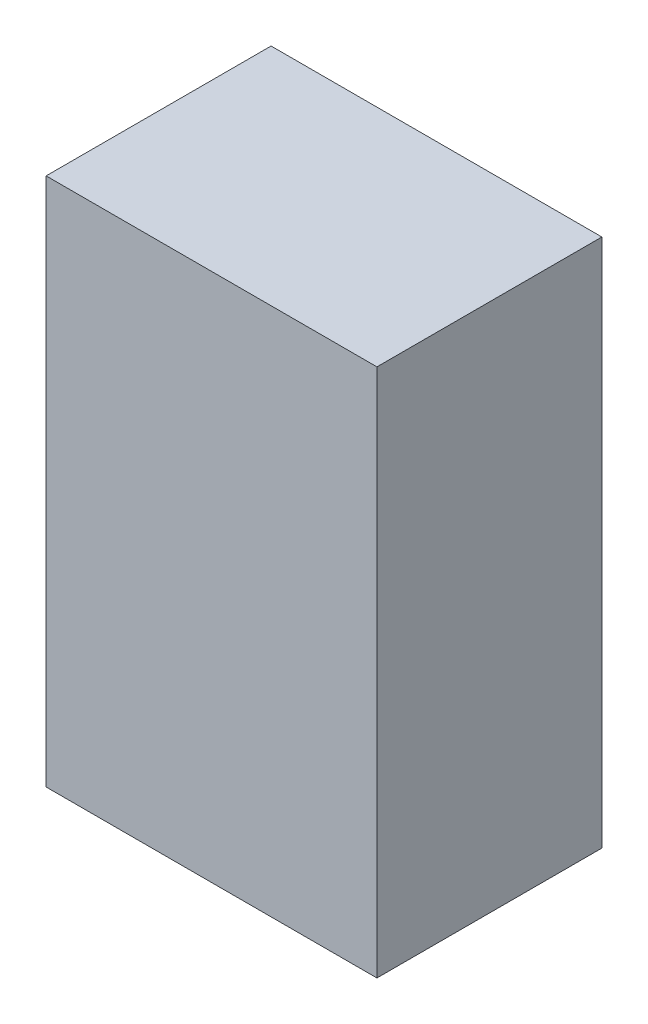
ISO-10303-21;
HEADER;
FILE_DESCRIPTION(('STEP AP214'),'2;1');
FILE_NAME('part.step','',(''),(''),'','','');
FILE_SCHEMA(('AUTOMOTIVE_DESIGN { 1 0 10303 214 1 1 1 1 }'));
ENDSEC;
DATA;
#1=APPLICATION_CONTEXT('core data for automotive mechanical design processes');
#2=APPLICATION_PROTOCOL_DEFINITION('international standard','automotive_design',2000,#1);
#3=PRODUCT_CONTEXT('',#1,'mechanical');
#4=PRODUCT('Part','Part','',(#3));
#5=PRODUCT_RELATED_PRODUCT_CATEGORY('part','',(#4));
#6=PRODUCT_DEFINITION_FORMATION('','',#4);
#7=PRODUCT_DEFINITION_CONTEXT('part definition',#1,'design');
#8=PRODUCT_DEFINITION('design','',#6,#7);
#9=PRODUCT_DEFINITION_SHAPE('','',#8);
#10=(LENGTH_UNIT() NAMED_UNIT(*) SI_UNIT(.MILLI.,.METRE.));
#11=(NAMED_UNIT(*) PLANE_ANGLE_UNIT() SI_UNIT($,.RADIAN.));
#12=(NAMED_UNIT(*) SI_UNIT($,.STERADIAN.) SOLID_ANGLE_UNIT());
#13=UNCERTAINTY_MEASURE_WITH_UNIT(LENGTH_MEASURE(1.E-05),#10,'distance_accuracy_value','');
#14=(GEOMETRIC_REPRESENTATION_CONTEXT(3) GLOBAL_UNCERTAINTY_ASSIGNED_CONTEXT((#13)) GLOBAL_UNIT_ASSIGNED_CONTEXT((#10,
#11,#12)) REPRESENTATION_CONTEXT('',''));
#15=CARTESIAN_POINT('',(0.,0.,0.));
#16=DIRECTION('',(0.,0.,1.));
#17=DIRECTION('',(1.,0.,0.));
#18=AXIS2_PLACEMENT_3D('',#15,#16,#17);
#19=CARTESIAN_POINT('',(158.75,508.,-107.95));
#20=DIRECTION('',(-1.,0.,0.));
#21=DIRECTION('',(0.,0.,1.));
#22=AXIS2_PLACEMENT_3D('',#19,#20,#21);
#23=PLANE('',#22);
#24=DIRECTION('',(0.,0.,-1.));
#25=VECTOR('',#24,1.);
#26=CARTESIAN_POINT('',(158.75,0.,-107.95));
#27=LINE('',#26,#25);
#28=CARTESIAN_POINT('',(158.75,0.,107.95));
#29=VERTEX_POINT('',#28);
#30=CARTESIAN_POINT('',(158.75,0.,-107.95));
#31=VERTEX_POINT('',#30);
#32=EDGE_CURVE('E96',#29,#31,#27,.T.);
#33=ORIENTED_EDGE('',*,*,#32,.T.);
#34=DIRECTION('',(0.,-1.,0.));
#35=VECTOR('',#34,1.);
#36=CARTESIAN_POINT('',(158.75,508.,-107.95));
#37=LINE('',#36,#35);
#38=CARTESIAN_POINT('',(158.75,508.,-107.95));
#39=VERTEX_POINT('',#38);
#40=EDGE_CURVE('E11',#39,#31,#37,.T.);
#41=ORIENTED_EDGE('',*,*,#40,.F.);
#42=DIRECTION('',(0.,0.,-1.));
#43=VECTOR('',#42,1.);
#44=CARTESIAN_POINT('',(158.75,508.,-107.95));
#45=LINE('',#44,#43);
#46=CARTESIAN_POINT('',(158.75,508.,107.95));
#47=VERTEX_POINT('',#46);
#48=EDGE_CURVE('E84',#47,#39,#45,.T.);
#49=ORIENTED_EDGE('',*,*,#48,.F.);
#50=DIRECTION('',(0.,-1.,0.));
#51=VECTOR('',#50,1.);
#52=CARTESIAN_POINT('',(158.75,508.,107.95));
#53=LINE('',#52,#51);
#54=EDGE_CURVE('E92',#47,#29,#53,.T.);
#55=ORIENTED_EDGE('',*,*,#54,.T.);
#56=EDGE_LOOP('',(#33,#41,#49,#55));
#57=FACE_BOUND('',#56,.T.);
#58=ADVANCED_FACE('F33',(#57),#23,.F.);
#59=CARTESIAN_POINT('',(-158.75,508.,-107.95));
#60=DIRECTION('',(0.,0.,1.));
#61=DIRECTION('',(1.,0.,0.));
#62=AXIS2_PLACEMENT_3D('',#59,#60,#61);
#63=PLANE('',#62);
#64=DIRECTION('',(-1.,0.,0.));
#65=VECTOR('',#64,1.);
#66=CARTESIAN_POINT('',(-158.75,0.,-107.95));
#67=LINE('',#66,#65);
#68=CARTESIAN_POINT('',(-158.75,0.,-107.95));
#69=VERTEX_POINT('',#68);
#70=EDGE_CURVE('E88',#31,#69,#67,.T.);
#71=ORIENTED_EDGE('',*,*,#70,.T.);
#72=DIRECTION('',(0.,-1.,0.));
#73=VECTOR('',#72,1.);
#74=CARTESIAN_POINT('',(-158.75,508.,-107.95));
#75=LINE('',#74,#73);
#76=CARTESIAN_POINT('',(-158.75,508.,-107.95));
#77=VERTEX_POINT('',#76);
#78=EDGE_CURVE('E41',#77,#69,#75,.T.);
#79=ORIENTED_EDGE('',*,*,#78,.F.);
#80=DIRECTION('',(-1.,0.,0.));
#81=VECTOR('',#80,1.);
#82=CARTESIAN_POINT('',(-158.75,508.,-107.95));
#83=LINE('',#82,#81);
#84=EDGE_CURVE('E79',#39,#77,#83,.T.);
#85=ORIENTED_EDGE('',*,*,#84,.F.);
#86=ORIENTED_EDGE('',*,*,#40,.T.);
#87=EDGE_LOOP('',(#71,#79,#85,#86));
#88=FACE_BOUND('',#87,.T.);
#89=ADVANCED_FACE('F87',(#88),#63,.F.);
#90=CARTESIAN_POINT('',(-158.75,508.,-107.95));
#91=DIRECTION('',(1.,0.,0.));
#92=DIRECTION('',(0.,0.,-1.));
#93=AXIS2_PLACEMENT_3D('',#90,#91,#92);
#94=PLANE('',#93);
#95=DIRECTION('',(0.,0.,1.));
#96=VECTOR('',#95,1.);
#97=CARTESIAN_POINT('',(-158.75,0.,-107.95));
#98=LINE('',#97,#96);
#99=CARTESIAN_POINT('',(-158.75,0.,107.95));
#100=VERTEX_POINT('',#99);
#101=EDGE_CURVE('E66',#69,#100,#98,.T.);
#102=ORIENTED_EDGE('',*,*,#101,.T.);
#103=DIRECTION('',(0.,-1.,0.));
#104=VECTOR('',#103,1.);
#105=CARTESIAN_POINT('',(-158.75,508.,107.95));
#106=LINE('',#105,#104);
#107=CARTESIAN_POINT('',(-158.75,508.,107.95));
#108=VERTEX_POINT('',#107);
#109=EDGE_CURVE('E89',#108,#100,#106,.T.);
#110=ORIENTED_EDGE('',*,*,#109,.F.);
#111=DIRECTION('',(0.,0.,1.));
#112=VECTOR('',#111,1.);
#113=CARTESIAN_POINT('',(-158.75,508.,-107.95));
#114=LINE('',#113,#112);
#115=EDGE_CURVE('E82',#77,#108,#114,.T.);
#116=ORIENTED_EDGE('',*,*,#115,.F.);
#117=ORIENTED_EDGE('',*,*,#78,.T.);
#118=EDGE_LOOP('',(#102,#110,#116,#117));
#119=FACE_BOUND('',#118,.T.);
#120=ADVANCED_FACE('F90',(#119),#94,.F.);
#121=CARTESIAN_POINT('',(-158.75,508.,107.95));
#122=DIRECTION('',(0.,0.,-1.));
#123=DIRECTION('',(-1.,0.,0.));
#124=AXIS2_PLACEMENT_3D('',#121,#122,#123);
#125=PLANE('',#124);
#126=DIRECTION('',(1.,0.,0.));
#127=VECTOR('',#126,1.);
#128=CARTESIAN_POINT('',(-158.75,0.,107.95));
#129=LINE('',#128,#127);
#130=EDGE_CURVE('E72',#100,#29,#129,.T.);
#131=ORIENTED_EDGE('',*,*,#130,.T.);
#132=ORIENTED_EDGE('',*,*,#54,.F.);
#133=DIRECTION('',(1.,0.,0.));
#134=VECTOR('',#133,1.);
#135=CARTESIAN_POINT('',(-158.75,508.,107.95));
#136=LINE('',#135,#134);
#137=EDGE_CURVE('E49',#108,#47,#136,.T.);
#138=ORIENTED_EDGE('',*,*,#137,.F.);
#139=ORIENTED_EDGE('',*,*,#109,.T.);
#140=EDGE_LOOP('',(#131,#132,#138,#139));
#141=FACE_BOUND('',#140,.T.);
#142=ADVANCED_FACE('F103',(#141),#125,.F.);
#143=CARTESIAN_POINT('',(0.,508.,0.));
#144=DIRECTION('',(0.,1.,0.));
#145=DIRECTION('',(0.,0.,1.));
#146=AXIS2_PLACEMENT_3D('',#143,#144,#145);
#147=PLANE('',#146);
#148=ORIENTED_EDGE('',*,*,#48,.T.);
#149=ORIENTED_EDGE('',*,*,#84,.T.);
#150=ORIENTED_EDGE('',*,*,#115,.T.);
#151=ORIENTED_EDGE('',*,*,#137,.T.);
#152=EDGE_LOOP('',(#148,#149,#150,#151));
#153=FACE_BOUND('',#152,.T.);
#154=ADVANCED_FACE('F80',(#153),#147,.T.);
#155=CARTESIAN_POINT('',(0.,0.,0.));
#156=DIRECTION('',(0.,1.,0.));
#157=DIRECTION('',(0.,0.,1.));
#158=AXIS2_PLACEMENT_3D('',#155,#156,#157);
#159=PLANE('',#158);
#160=ORIENTED_EDGE('',*,*,#32,.F.);
#161=ORIENTED_EDGE('',*,*,#130,.F.);
#162=ORIENTED_EDGE('',*,*,#101,.F.);
#163=ORIENTED_EDGE('',*,*,#70,.F.);
#164=EDGE_LOOP('',(#160,#161,#162,#163));
#165=FACE_BOUND('',#164,.T.);
#166=ADVANCED_FACE('F106',(#165),#159,.F.);
#167=CLOSED_SHELL('',(#58,#89,#120,#142,#154,#166));
#168=MANIFOLD_SOLID_BREP('B2',#167);
#169=ADVANCED_BREP_SHAPE_REPRESENTATION('',(#18,#168),#14);
#170=SHAPE_DEFINITION_REPRESENTATION(#9,#169);
ENDSEC;
END-ISO-10303-21;
